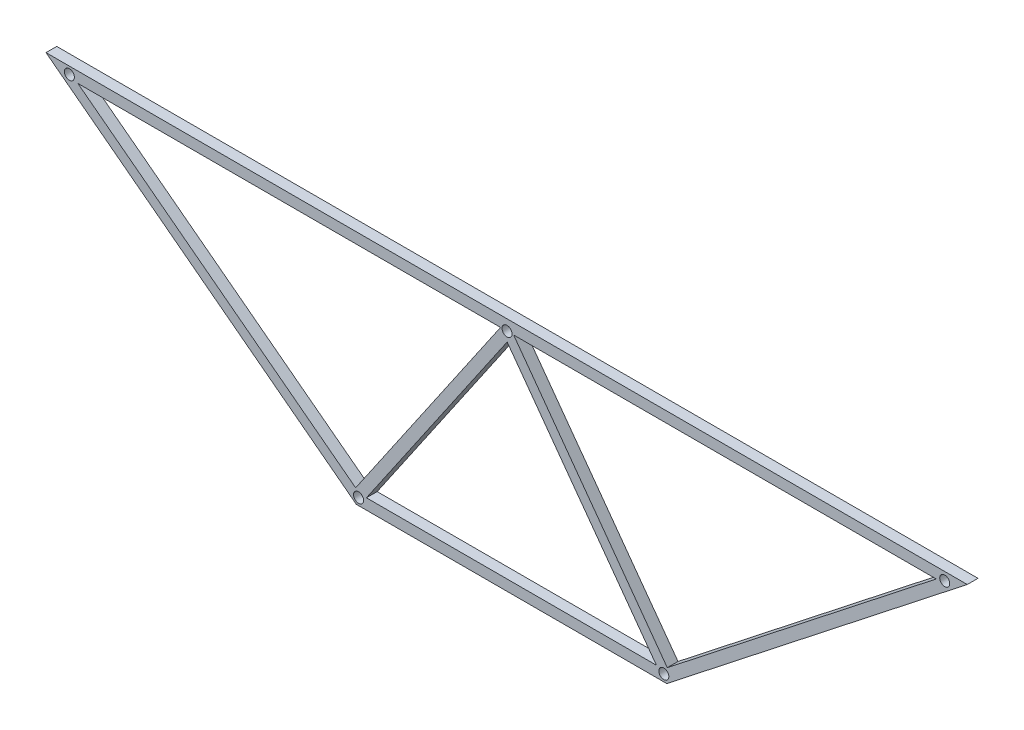
ISO-10303-21;
HEADER;
FILE_DESCRIPTION(('STEP AP214'),'2;1');
FILE_NAME('part.step','',(''),(''),'','','');
FILE_SCHEMA(('AUTOMOTIVE_DESIGN { 1 0 10303 214 1 1 1 1 }'));
ENDSEC;
DATA;
#1=APPLICATION_CONTEXT('core data for automotive mechanical design processes');
#2=APPLICATION_PROTOCOL_DEFINITION('international standard','automotive_design',2000,#1);
#3=PRODUCT_CONTEXT('',#1,'mechanical');
#4=PRODUCT('Part','Part','',(#3));
#5=PRODUCT_RELATED_PRODUCT_CATEGORY('part','',(#4));
#6=PRODUCT_DEFINITION_FORMATION('','',#4);
#7=PRODUCT_DEFINITION_CONTEXT('part definition',#1,'design');
#8=PRODUCT_DEFINITION('design','',#6,#7);
#9=PRODUCT_DEFINITION_SHAPE('','',#8);
#10=(LENGTH_UNIT() NAMED_UNIT(*) SI_UNIT(.MILLI.,.METRE.));
#11=(NAMED_UNIT(*) PLANE_ANGLE_UNIT() SI_UNIT($,.RADIAN.));
#12=(NAMED_UNIT(*) SI_UNIT($,.STERADIAN.) SOLID_ANGLE_UNIT());
#13=UNCERTAINTY_MEASURE_WITH_UNIT(LENGTH_MEASURE(1.E-05),#10,'distance_accuracy_value','');
#14=(GEOMETRIC_REPRESENTATION_CONTEXT(3) GLOBAL_UNCERTAINTY_ASSIGNED_CONTEXT((#13)) GLOBAL_UNIT_ASSIGNED_CONTEXT((#10,
#11,#12)) REPRESENTATION_CONTEXT('',''));
#15=CARTESIAN_POINT('',(0.,0.,0.));
#16=DIRECTION('',(0.,0.,1.));
#17=DIRECTION('',(1.,0.,0.));
#18=AXIS2_PLACEMENT_3D('',#15,#16,#17);
#19=CARTESIAN_POINT('',(0.,0.,15.));
#20=DIRECTION('',(0.,0.,-1.));
#21=DIRECTION('',(-1.,0.,0.));
#22=AXIS2_PLACEMENT_3D('',#19,#20,#21);
#23=PLANE('',#22);
#24=CARTESIAN_POINT('',(-611.831081683874,4.9049906281482,15.));
#25=DIRECTION('',(0.,0.,1.));
#26=DIRECTION('',(1.,0.,0.));
#27=AXIS2_PLACEMENT_3D('',#24,#25,#26);
#28=CIRCLE('',#27,7.00000000000004);
#29=CARTESIAN_POINT('',(-604.831081683874,4.9049906281482,15.));
#30=VERTEX_POINT('',#29);
#31=EDGE_CURVE('E413',#30,#30,#28,.T.);
#32=ORIENTED_EDGE('',*,*,#31,.F.);
#33=EDGE_LOOP('',(#32));
#34=FACE_BOUND('',#33,.T.);
#35=CARTESIAN_POINT('',(219.201774513465,-305.21160756031,15.));
#36=DIRECTION('',(0.,0.,1.));
#37=DIRECTION('',(1.,0.,0.));
#38=AXIS2_PLACEMENT_3D('',#35,#36,#37);
#39=CIRCLE('',#38,7.00000000000002);
#40=CARTESIAN_POINT('',(226.201774513465,-305.21160756031,15.));
#41=VERTEX_POINT('',#40);
#42=EDGE_CURVE('E426',#41,#41,#39,.T.);
#43=ORIENTED_EDGE('',*,*,#42,.F.);
#44=EDGE_LOOP('',(#43));
#45=FACE_BOUND('',#44,.T.);
#46=CARTESIAN_POINT('',(0.,0.,15.));
#47=DIRECTION('',(0.,0.,1.));
#48=DIRECTION('',(1.,0.,0.));
#49=AXIS2_PLACEMENT_3D('',#46,#47,#48);
#50=CIRCLE('',#49,7.);
#51=CARTESIAN_POINT('',(7.,0.,15.));
#52=VERTEX_POINT('',#51);
#53=EDGE_CURVE('E420',#52,#52,#50,.T.);
#54=ORIENTED_EDGE('',*,*,#53,.F.);
#55=EDGE_LOOP('',(#54));
#56=FACE_BOUND('',#55,.T.);
#57=CARTESIAN_POINT('',(-207.544546048894,-305.21160756031,15.));
#58=DIRECTION('',(0.,0.,1.));
#59=DIRECTION('',(1.,0.,0.));
#60=AXIS2_PLACEMENT_3D('',#57,#58,#59);
#61=CIRCLE('',#60,7.00000000000002);
#62=CARTESIAN_POINT('',(-200.544546048894,-305.21160756031,15.));
#63=VERTEX_POINT('',#62);
#64=EDGE_CURVE('E432',#63,#63,#61,.T.);
#65=ORIENTED_EDGE('',*,*,#64,.F.);
#66=EDGE_LOOP('',(#65));
#67=FACE_BOUND('',#66,.T.);
#68=CARTESIAN_POINT('',(611.879096148243,3.70627865372342,15.));
#69=DIRECTION('',(0.,0.,1.));
#70=DIRECTION('',(1.,0.,0.));
#71=AXIS2_PLACEMENT_3D('',#68,#69,#70);
#72=CIRCLE('',#71,7.00000000000004);
#73=CARTESIAN_POINT('',(618.879096148243,3.70627865372342,15.));
#74=VERTEX_POINT('',#73);
#75=EDGE_CURVE('E414',#74,#74,#72,.T.);
#76=ORIENTED_EDGE('',*,*,#75,.F.);
#77=EDGE_LOOP('',(#76));
#78=FACE_BOUND('',#77,.T.);
#79=DIRECTION('',(0.795877335068835,-0.605457899051395,0.));
#80=VECTOR('',#79,1.);
#81=CARTESIAN_POINT('',(-600.,0.,15.));
#82=LINE('',#81,#80);
#83=CARTESIAN_POINT('',(-600.,0.,15.));
#84=VERTEX_POINT('',#83);
#85=CARTESIAN_POINT('',(-211.624925428095,-295.453515677635,15.));
#86=VERTEX_POINT('',#85);
#87=EDGE_CURVE('E162',#84,#86,#82,.T.);
#88=ORIENTED_EDGE('',*,*,#87,.F.);
#89=DIRECTION('',(-1.,0.,0.));
#90=VECTOR('',#89,1.);
#91=CARTESIAN_POINT('',(-9.09296864472943,0.,15.));
#92=LINE('',#91,#90);
#93=CARTESIAN_POINT('',(-9.09296864472943,0.,15.));
#94=VERTEX_POINT('',#93);
#95=EDGE_CURVE('E166',#94,#84,#92,.T.);
#96=ORIENTED_EDGE('',*,*,#95,.F.);
#97=DIRECTION('',(0.565405418856181,0.824813137824602,0.));
#98=VECTOR('',#97,1.);
#99=CARTESIAN_POINT('',(-9.09296864472943,0.,15.));
#100=LINE('',#99,#98);
#101=EDGE_CURVE('E164',#86,#94,#100,.T.);
#102=ORIENTED_EDGE('',*,*,#101,.F.);
#103=EDGE_LOOP('',(#88,#96,#102));
#104=FACE_BOUND('',#103,.T.);
#105=DIRECTION('',(0.795877335068835,-0.605457899051396,0.));
#106=VECTOR('',#105,1.);
#107=CARTESIAN_POINT('',(-644.492210058268,15.,15.));
#108=LINE('',#107,#106);
#109=CARTESIAN_POINT('',(-644.492210058268,15.,15.));
#110=VERTEX_POINT('',#109);
#111=CARTESIAN_POINT('',(-210.705614847921,-315.,15.));
#112=VERTEX_POINT('',#111);
#113=EDGE_CURVE('E211',#110,#112,#108,.T.);
#114=ORIENTED_EDGE('',*,*,#113,.T.);
#115=DIRECTION('',(1.,0.,0.));
#116=VECTOR('',#115,1.);
#117=CARTESIAN_POINT('',(223.310378921664,-315.,15.));
#118=LINE('',#117,#116);
#119=CARTESIAN_POINT('',(223.310378921664,-315.,15.));
#120=VERTEX_POINT('',#119);
#121=EDGE_CURVE('E212',#112,#120,#118,.T.);
#122=ORIENTED_EDGE('',*,*,#121,.T.);
#123=DIRECTION('',(0.78636452058146,0.617762770625335,0.));
#124=VECTOR('',#123,1.);
#125=CARTESIAN_POINT('',(643.37501235563,15.,15.));
#126=LINE('',#125,#124);
#127=CARTESIAN_POINT('',(643.37501235563,15.,15.));
#128=VERTEX_POINT('',#127);
#129=EDGE_CURVE('E220',#120,#128,#126,.T.);
#130=ORIENTED_EDGE('',*,*,#129,.T.);
#131=DIRECTION('',(-1.,0.,0.));
#132=VECTOR('',#131,1.);
#133=CARTESIAN_POINT('',(-644.492210058268,15.,15.));
#134=LINE('',#133,#132);
#135=EDGE_CURVE('E218',#128,#110,#134,.T.);
#136=ORIENTED_EDGE('',*,*,#135,.T.);
#137=EDGE_LOOP('',(#114,#122,#130,#136));
#138=FACE_BOUND('',#137,.T.);
#139=DIRECTION('',(0.78636452058146,0.617762770625335,0.));
#140=VECTOR('',#139,1.);
#141=CARTESIAN_POINT('',(600.,0.,15.));
#142=LINE('',#141,#140);
#143=CARTESIAN_POINT('',(224.024883314789,-295.363567010752,15.));
#144=VERTEX_POINT('',#143);
#145=CARTESIAN_POINT('',(600.,0.,15.));
#146=VERTEX_POINT('',#145);
#147=EDGE_CURVE('E190',#144,#146,#142,.T.);
#148=ORIENTED_EDGE('',*,*,#147,.F.);
#149=DIRECTION('',(0.588068082242328,-0.808811430834054,0.));
#150=VECTOR('',#149,1.);
#151=CARTESIAN_POINT('',(9.27286597849628,0.,15.));
#152=LINE('',#151,#150);
#153=CARTESIAN_POINT('',(9.27286597849628,0.,15.));
#154=VERTEX_POINT('',#153);
#155=EDGE_CURVE('E192',#154,#144,#152,.T.);
#156=ORIENTED_EDGE('',*,*,#155,.F.);
#157=DIRECTION('',(-1.,0.,0.));
#158=VECTOR('',#157,1.);
#159=CARTESIAN_POINT('',(9.27286597849628,0.,15.));
#160=LINE('',#159,#158);
#161=EDGE_CURVE('E186',#146,#154,#160,.T.);
#162=ORIENTED_EDGE('',*,*,#161,.F.);
#163=EDGE_LOOP('',(#148,#156,#162));
#164=FACE_BOUND('',#163,.T.);
#165=DIRECTION('',(-0.588068082242328,0.808811430834054,0.));
#166=VECTOR('',#165,1.);
#167=CARTESIAN_POINT('',(0.180367695807343,-13.0016977370513,15.));
#168=LINE('',#167,#166);
#169=CARTESIAN_POINT('',(208.850194536081,-300.,15.));
#170=VERTEX_POINT('',#169);
#171=CARTESIAN_POINT('',(0.180367695807343,-13.0016977370513,15.));
#172=VERTEX_POINT('',#171);
#173=EDGE_CURVE('E131',#170,#172,#168,.T.);
#174=ORIENTED_EDGE('',*,*,#173,.F.);
#175=DIRECTION('',(1.,0.,0.));
#176=VECTOR('',#175,1.);
#177=CARTESIAN_POINT('',(208.850194536081,-300.,15.));
#178=LINE('',#177,#176);
#179=CARTESIAN_POINT('',(-196.555581164045,-300.,15.));
#180=VERTEX_POINT('',#179);
#181=EDGE_CURVE('E151',#180,#170,#178,.T.);
#182=ORIENTED_EDGE('',*,*,#181,.F.);
#183=DIRECTION('',(-0.565405418856181,-0.824813137824602,0.));
#184=VECTOR('',#183,1.);
#185=CARTESIAN_POINT('',(0.180367695807343,-13.0016977370513,15.));
#186=LINE('',#185,#184);
#187=EDGE_CURVE('E142',#172,#180,#186,.T.);
#188=ORIENTED_EDGE('',*,*,#187,.F.);
#189=EDGE_LOOP('',(#174,#182,#188));
#190=FACE_BOUND('',#189,.T.);
#191=ADVANCED_FACE('F39',(#34,#45,#56,#67,#78,#104,#138,#164,#190),#23,.F.);
#192=CARTESIAN_POINT('',(0.,0.,0.));
#193=DIRECTION('',(0.,0.,-1.));
#194=DIRECTION('',(-1.,0.,0.));
#195=AXIS2_PLACEMENT_3D('',#192,#193,#194);
#196=PLANE('',#195);
#197=CARTESIAN_POINT('',(-611.831081683874,4.9049906281482,0.));
#198=DIRECTION('',(0.,0.,1.));
#199=DIRECTION('',(1.,0.,0.));
#200=AXIS2_PLACEMENT_3D('',#197,#198,#199);
#201=CIRCLE('',#200,7.00000000000004);
#202=CARTESIAN_POINT('',(-604.831081683874,4.9049906281482,0.));
#203=VERTEX_POINT('',#202);
#204=EDGE_CURVE('E160',#203,#203,#201,.T.);
#205=ORIENTED_EDGE('',*,*,#204,.T.);
#206=EDGE_LOOP('',(#205));
#207=FACE_BOUND('',#206,.T.);
#208=CARTESIAN_POINT('',(219.201774513465,-305.21160756031,0.));
#209=DIRECTION('',(0.,0.,1.));
#210=DIRECTION('',(1.,0.,0.));
#211=AXIS2_PLACEMENT_3D('',#208,#209,#210);
#212=CIRCLE('',#211,7.00000000000002);
#213=CARTESIAN_POINT('',(226.201774513465,-305.21160756031,0.));
#214=VERTEX_POINT('',#213);
#215=EDGE_CURVE('E427',#214,#214,#212,.T.);
#216=ORIENTED_EDGE('',*,*,#215,.T.);
#217=EDGE_LOOP('',(#216));
#218=FACE_BOUND('',#217,.T.);
#219=CARTESIAN_POINT('',(0.,0.,0.));
#220=DIRECTION('',(0.,0.,1.));
#221=DIRECTION('',(1.,0.,0.));
#222=AXIS2_PLACEMENT_3D('',#219,#220,#221);
#223=CIRCLE('',#222,7.);
#224=CARTESIAN_POINT('',(7.,0.,0.));
#225=VERTEX_POINT('',#224);
#226=EDGE_CURVE('E421',#225,#225,#223,.T.);
#227=ORIENTED_EDGE('',*,*,#226,.T.);
#228=EDGE_LOOP('',(#227));
#229=FACE_BOUND('',#228,.T.);
#230=CARTESIAN_POINT('',(-207.544546048894,-305.21160756031,0.));
#231=DIRECTION('',(0.,0.,1.));
#232=DIRECTION('',(1.,0.,0.));
#233=AXIS2_PLACEMENT_3D('',#230,#231,#232);
#234=CIRCLE('',#233,7.00000000000002);
#235=CARTESIAN_POINT('',(-200.544546048894,-305.21160756031,0.));
#236=VERTEX_POINT('',#235);
#237=EDGE_CURVE('E425',#236,#236,#234,.T.);
#238=ORIENTED_EDGE('',*,*,#237,.T.);
#239=EDGE_LOOP('',(#238));
#240=FACE_BOUND('',#239,.T.);
#241=CARTESIAN_POINT('',(611.879096148243,3.70627865372342,0.));
#242=DIRECTION('',(0.,0.,1.));
#243=DIRECTION('',(1.,0.,0.));
#244=AXIS2_PLACEMENT_3D('',#241,#242,#243);
#245=CIRCLE('',#244,7.00000000000004);
#246=CARTESIAN_POINT('',(618.879096148243,3.70627865372342,0.));
#247=VERTEX_POINT('',#246);
#248=EDGE_CURVE('E418',#247,#247,#245,.T.);
#249=ORIENTED_EDGE('',*,*,#248,.T.);
#250=EDGE_LOOP('',(#249));
#251=FACE_BOUND('',#250,.T.);
#252=DIRECTION('',(0.795877335068835,-0.605457899051396,0.));
#253=VECTOR('',#252,1.);
#254=CARTESIAN_POINT('',(-644.492210058268,15.,0.));
#255=LINE('',#254,#253);
#256=CARTESIAN_POINT('',(-644.492210058268,15.,0.));
#257=VERTEX_POINT('',#256);
#258=CARTESIAN_POINT('',(-210.705614847921,-315.,0.));
#259=VERTEX_POINT('',#258);
#260=EDGE_CURVE('E209',#257,#259,#255,.T.);
#261=ORIENTED_EDGE('',*,*,#260,.F.);
#262=DIRECTION('',(-1.,0.,0.));
#263=VECTOR('',#262,1.);
#264=CARTESIAN_POINT('',(-644.492210058268,15.,0.));
#265=LINE('',#264,#263);
#266=CARTESIAN_POINT('',(643.37501235563,15.,0.));
#267=VERTEX_POINT('',#266);
#268=EDGE_CURVE('E214',#267,#257,#265,.T.);
#269=ORIENTED_EDGE('',*,*,#268,.F.);
#270=DIRECTION('',(0.78636452058146,0.617762770625335,0.));
#271=VECTOR('',#270,1.);
#272=CARTESIAN_POINT('',(643.37501235563,15.,0.));
#273=LINE('',#272,#271);
#274=CARTESIAN_POINT('',(223.310378921664,-315.,0.));
#275=VERTEX_POINT('',#274);
#276=EDGE_CURVE('E227',#275,#267,#273,.T.);
#277=ORIENTED_EDGE('',*,*,#276,.F.);
#278=DIRECTION('',(1.,0.,0.));
#279=VECTOR('',#278,1.);
#280=CARTESIAN_POINT('',(223.310378921664,-315.,0.));
#281=LINE('',#280,#279);
#282=EDGE_CURVE('E221',#259,#275,#281,.T.);
#283=ORIENTED_EDGE('',*,*,#282,.F.);
#284=EDGE_LOOP('',(#261,#269,#277,#283));
#285=FACE_BOUND('',#284,.T.);
#286=DIRECTION('',(0.588068082242328,-0.808811430834054,0.));
#287=VECTOR('',#286,1.);
#288=CARTESIAN_POINT('',(9.27286597849628,0.,0.));
#289=LINE('',#288,#287);
#290=CARTESIAN_POINT('',(9.27286597849628,0.,0.));
#291=VERTEX_POINT('',#290);
#292=CARTESIAN_POINT('',(224.024883314789,-295.363567010752,0.));
#293=VERTEX_POINT('',#292);
#294=EDGE_CURVE('E188',#291,#293,#289,.T.);
#295=ORIENTED_EDGE('',*,*,#294,.T.);
#296=DIRECTION('',(0.78636452058146,0.617762770625335,0.));
#297=VECTOR('',#296,1.);
#298=CARTESIAN_POINT('',(600.,0.,0.));
#299=LINE('',#298,#297);
#300=CARTESIAN_POINT('',(600.,0.,0.));
#301=VERTEX_POINT('',#300);
#302=EDGE_CURVE('E187',#293,#301,#299,.T.);
#303=ORIENTED_EDGE('',*,*,#302,.T.);
#304=DIRECTION('',(-1.,0.,0.));
#305=VECTOR('',#304,1.);
#306=CARTESIAN_POINT('',(9.27286597849628,0.,0.));
#307=LINE('',#306,#305);
#308=EDGE_CURVE('E196',#301,#291,#307,.T.);
#309=ORIENTED_EDGE('',*,*,#308,.T.);
#310=EDGE_LOOP('',(#295,#303,#309));
#311=FACE_BOUND('',#310,.T.);
#312=DIRECTION('',(-1.,0.,0.));
#313=VECTOR('',#312,1.);
#314=CARTESIAN_POINT('',(-9.09296864472943,0.,0.));
#315=LINE('',#314,#313);
#316=CARTESIAN_POINT('',(-9.09296864472943,0.,0.));
#317=VERTEX_POINT('',#316);
#318=CARTESIAN_POINT('',(-600.,0.,0.));
#319=VERTEX_POINT('',#318);
#320=EDGE_CURVE('E167',#317,#319,#315,.T.);
#321=ORIENTED_EDGE('',*,*,#320,.T.);
#322=DIRECTION('',(0.795877335068835,-0.605457899051395,0.));
#323=VECTOR('',#322,1.);
#324=CARTESIAN_POINT('',(-600.,0.,0.));
#325=LINE('',#324,#323);
#326=CARTESIAN_POINT('',(-211.624925428095,-295.453515677635,0.));
#327=VERTEX_POINT('',#326);
#328=EDGE_CURVE('E149',#319,#327,#325,.T.);
#329=ORIENTED_EDGE('',*,*,#328,.T.);
#330=DIRECTION('',(0.565405418856181,0.824813137824602,0.));
#331=VECTOR('',#330,1.);
#332=CARTESIAN_POINT('',(-9.09296864472943,0.,0.));
#333=LINE('',#332,#331);
#334=EDGE_CURVE('E171',#327,#317,#333,.T.);
#335=ORIENTED_EDGE('',*,*,#334,.T.);
#336=EDGE_LOOP('',(#321,#329,#335));
#337=FACE_BOUND('',#336,.T.);
#338=DIRECTION('',(1.,0.,0.));
#339=VECTOR('',#338,1.);
#340=CARTESIAN_POINT('',(208.850194536081,-300.,0.));
#341=LINE('',#340,#339);
#342=CARTESIAN_POINT('',(-196.555581164045,-300.,0.));
#343=VERTEX_POINT('',#342);
#344=CARTESIAN_POINT('',(208.850194536081,-300.,0.));
#345=VERTEX_POINT('',#344);
#346=EDGE_CURVE('E141',#343,#345,#341,.T.);
#347=ORIENTED_EDGE('',*,*,#346,.T.);
#348=DIRECTION('',(-0.588068082242328,0.808811430834054,0.));
#349=VECTOR('',#348,1.);
#350=CARTESIAN_POINT('',(0.180367695807343,-13.0016977370513,0.));
#351=LINE('',#350,#349);
#352=CARTESIAN_POINT('',(0.180367695807343,-13.0016977370513,0.));
#353=VERTEX_POINT('',#352);
#354=EDGE_CURVE('E65',#345,#353,#351,.T.);
#355=ORIENTED_EDGE('',*,*,#354,.T.);
#356=DIRECTION('',(-0.565405418856181,-0.824813137824602,0.));
#357=VECTOR('',#356,1.);
#358=CARTESIAN_POINT('',(0.180367695807343,-13.0016977370513,0.));
#359=LINE('',#358,#357);
#360=EDGE_CURVE('E146',#353,#343,#359,.T.);
#361=ORIENTED_EDGE('',*,*,#360,.T.);
#362=EDGE_LOOP('',(#347,#355,#361));
#363=FACE_BOUND('',#362,.T.);
#364=ADVANCED_FACE('F241',(#207,#218,#229,#240,#251,#285,#311,#337,#363),#196,.T.);
#365=CARTESIAN_POINT('',(-644.492210058268,15.,15.));
#366=DIRECTION('',(0.605457899051395,0.795877335068835,0.));
#367=DIRECTION('',(-0.795877335068835,0.605457899051395,0.));
#368=AXIS2_PLACEMENT_3D('',#365,#366,#367);
#369=PLANE('',#368);
#370=ORIENTED_EDGE('',*,*,#260,.T.);
#371=DIRECTION('',(0.,0.,-1.));
#372=VECTOR('',#371,1.);
#373=CARTESIAN_POINT('',(-210.705614847921,-315.,15.));
#374=LINE('',#373,#372);
#375=EDGE_CURVE('E11',#112,#259,#374,.T.);
#376=ORIENTED_EDGE('',*,*,#375,.F.);
#377=ORIENTED_EDGE('',*,*,#113,.F.);
#378=DIRECTION('',(0.,0.,-1.));
#379=VECTOR('',#378,1.);
#380=CARTESIAN_POINT('',(-644.492210058268,15.,15.));
#381=LINE('',#380,#379);
#382=EDGE_CURVE('E222',#110,#257,#381,.T.);
#383=ORIENTED_EDGE('',*,*,#382,.T.);
#384=EDGE_LOOP('',(#370,#376,#377,#383));
#385=FACE_BOUND('',#384,.T.);
#386=ADVANCED_FACE('F41',(#385),#369,.F.);
#387=CARTESIAN_POINT('',(223.310378921664,-315.,15.));
#388=DIRECTION('',(0.,1.,0.));
#389=DIRECTION('',(-1.,0.,0.));
#390=AXIS2_PLACEMENT_3D('',#387,#388,#389);
#391=PLANE('',#390);
#392=ORIENTED_EDGE('',*,*,#282,.T.);
#393=DIRECTION('',(0.,0.,-1.));
#394=VECTOR('',#393,1.);
#395=CARTESIAN_POINT('',(223.310378921664,-315.,15.));
#396=LINE('',#395,#394);
#397=EDGE_CURVE('E50',#120,#275,#396,.T.);
#398=ORIENTED_EDGE('',*,*,#397,.F.);
#399=ORIENTED_EDGE('',*,*,#121,.F.);
#400=ORIENTED_EDGE('',*,*,#375,.T.);
#401=EDGE_LOOP('',(#392,#398,#399,#400));
#402=FACE_BOUND('',#401,.T.);
#403=ADVANCED_FACE('F254',(#402),#391,.F.);
#404=CARTESIAN_POINT('',(643.37501235563,15.,15.));
#405=DIRECTION('',(-0.617762770625335,0.78636452058146,0.));
#406=DIRECTION('',(-0.78636452058146,-0.617762770625335,0.));
#407=AXIS2_PLACEMENT_3D('',#404,#405,#406);
#408=PLANE('',#407);
#409=ORIENTED_EDGE('',*,*,#276,.T.);
#410=DIRECTION('',(0.,0.,-1.));
#411=VECTOR('',#410,1.);
#412=CARTESIAN_POINT('',(643.37501235563,15.,15.));
#413=LINE('',#412,#411);
#414=EDGE_CURVE('E233',#128,#267,#413,.T.);
#415=ORIENTED_EDGE('',*,*,#414,.F.);
#416=ORIENTED_EDGE('',*,*,#129,.F.);
#417=ORIENTED_EDGE('',*,*,#397,.T.);
#418=EDGE_LOOP('',(#409,#415,#416,#417));
#419=FACE_BOUND('',#418,.T.);
#420=ADVANCED_FACE('F236',(#419),#408,.F.);
#421=CARTESIAN_POINT('',(-644.492210058268,15.,15.));
#422=DIRECTION('',(0.,-1.,0.));
#423=DIRECTION('',(1.,0.,0.));
#424=AXIS2_PLACEMENT_3D('',#421,#422,#423);
#425=PLANE('',#424);
#426=ORIENTED_EDGE('',*,*,#268,.T.);
#427=ORIENTED_EDGE('',*,*,#382,.F.);
#428=ORIENTED_EDGE('',*,*,#135,.F.);
#429=ORIENTED_EDGE('',*,*,#414,.T.);
#430=EDGE_LOOP('',(#426,#427,#428,#429));
#431=FACE_BOUND('',#430,.T.);
#432=ADVANCED_FACE('F247',(#431),#425,.F.);
#433=CARTESIAN_POINT('',(600.,0.,15.));
#434=DIRECTION('',(-0.617762770625335,0.78636452058146,0.));
#435=DIRECTION('',(-0.78636452058146,-0.617762770625335,0.));
#436=AXIS2_PLACEMENT_3D('',#433,#434,#435);
#437=PLANE('',#436);
#438=ORIENTED_EDGE('',*,*,#302,.F.);
#439=DIRECTION('',(0.,0.,-1.));
#440=VECTOR('',#439,1.);
#441=CARTESIAN_POINT('',(224.024883314789,-295.363567010752,15.));
#442=LINE('',#441,#440);
#443=EDGE_CURVE('E191',#144,#293,#442,.T.);
#444=ORIENTED_EDGE('',*,*,#443,.F.);
#445=ORIENTED_EDGE('',*,*,#147,.T.);
#446=DIRECTION('',(0.,0.,-1.));
#447=VECTOR('',#446,1.);
#448=CARTESIAN_POINT('',(600.,0.,15.));
#449=LINE('',#448,#447);
#450=EDGE_CURVE('E210',#146,#301,#449,.T.);
#451=ORIENTED_EDGE('',*,*,#450,.T.);
#452=EDGE_LOOP('',(#438,#444,#445,#451));
#453=FACE_BOUND('',#452,.T.);
#454=ADVANCED_FACE('F273',(#453),#437,.T.);
#455=CARTESIAN_POINT('',(9.27286597849628,0.,15.));
#456=DIRECTION('',(0.,-1.,0.));
#457=DIRECTION('',(1.,0.,0.));
#458=AXIS2_PLACEMENT_3D('',#455,#456,#457);
#459=PLANE('',#458);
#460=ORIENTED_EDGE('',*,*,#308,.F.);
#461=ORIENTED_EDGE('',*,*,#450,.F.);
#462=ORIENTED_EDGE('',*,*,#161,.T.);
#463=DIRECTION('',(0.,0.,-1.));
#464=VECTOR('',#463,1.);
#465=CARTESIAN_POINT('',(9.27286597849628,0.,15.));
#466=LINE('',#465,#464);
#467=EDGE_CURVE('E202',#154,#291,#466,.T.);
#468=ORIENTED_EDGE('',*,*,#467,.T.);
#469=EDGE_LOOP('',(#460,#461,#462,#468));
#470=FACE_BOUND('',#469,.T.);
#471=ADVANCED_FACE('F282',(#470),#459,.T.);
#472=CARTESIAN_POINT('',(9.27286597849628,0.,15.));
#473=DIRECTION('',(0.808811430834054,0.588068082242328,0.));
#474=DIRECTION('',(-0.588068082242328,0.808811430834054,0.));
#475=AXIS2_PLACEMENT_3D('',#472,#473,#474);
#476=PLANE('',#475);
#477=ORIENTED_EDGE('',*,*,#294,.F.);
#478=ORIENTED_EDGE('',*,*,#467,.F.);
#479=ORIENTED_EDGE('',*,*,#155,.T.);
#480=ORIENTED_EDGE('',*,*,#443,.T.);
#481=EDGE_LOOP('',(#477,#478,#479,#480));
#482=FACE_BOUND('',#481,.T.);
#483=ADVANCED_FACE('F288',(#482),#476,.T.);
#484=CARTESIAN_POINT('',(-600.,0.,15.));
#485=DIRECTION('',(0.605457899051395,0.795877335068835,0.));
#486=DIRECTION('',(-0.795877335068835,0.605457899051395,0.));
#487=AXIS2_PLACEMENT_3D('',#484,#485,#486);
#488=PLANE('',#487);
#489=ORIENTED_EDGE('',*,*,#328,.F.);
#490=DIRECTION('',(0.,0.,-1.));
#491=VECTOR('',#490,1.);
#492=CARTESIAN_POINT('',(-600.,0.,15.));
#493=LINE('',#492,#491);
#494=EDGE_CURVE('E172',#84,#319,#493,.T.);
#495=ORIENTED_EDGE('',*,*,#494,.F.);
#496=ORIENTED_EDGE('',*,*,#87,.T.);
#497=DIRECTION('',(0.,0.,-1.));
#498=VECTOR('',#497,1.);
#499=CARTESIAN_POINT('',(-211.624925428095,-295.453515677635,15.));
#500=LINE('',#499,#498);
#501=EDGE_CURVE('E181',#86,#327,#500,.T.);
#502=ORIENTED_EDGE('',*,*,#501,.T.);
#503=EDGE_LOOP('',(#489,#495,#496,#502));
#504=FACE_BOUND('',#503,.T.);
#505=ADVANCED_FACE('F319',(#504),#488,.T.);
#506=CARTESIAN_POINT('',(-9.09296864472943,0.,15.));
#507=DIRECTION('',(-0.824813137824602,0.565405418856181,0.));
#508=DIRECTION('',(-0.565405418856181,-0.824813137824602,0.));
#509=AXIS2_PLACEMENT_3D('',#506,#507,#508);
#510=PLANE('',#509);
#511=ORIENTED_EDGE('',*,*,#334,.F.);
#512=ORIENTED_EDGE('',*,*,#501,.F.);
#513=ORIENTED_EDGE('',*,*,#101,.T.);
#514=DIRECTION('',(0.,0.,-1.));
#515=VECTOR('',#514,1.);
#516=CARTESIAN_POINT('',(-9.09296864472943,0.,15.));
#517=LINE('',#516,#515);
#518=EDGE_CURVE('E182',#94,#317,#517,.T.);
#519=ORIENTED_EDGE('',*,*,#518,.T.);
#520=EDGE_LOOP('',(#511,#512,#513,#519));
#521=FACE_BOUND('',#520,.T.);
#522=ADVANCED_FACE('F316',(#521),#510,.T.);
#523=CARTESIAN_POINT('',(-9.09296864472943,0.,15.));
#524=DIRECTION('',(0.,-1.,0.));
#525=DIRECTION('',(1.,0.,0.));
#526=AXIS2_PLACEMENT_3D('',#523,#524,#525);
#527=PLANE('',#526);
#528=ORIENTED_EDGE('',*,*,#320,.F.);
#529=ORIENTED_EDGE('',*,*,#518,.F.);
#530=ORIENTED_EDGE('',*,*,#95,.T.);
#531=ORIENTED_EDGE('',*,*,#494,.T.);
#532=EDGE_LOOP('',(#528,#529,#530,#531));
#533=FACE_BOUND('',#532,.T.);
#534=ADVANCED_FACE('F311',(#533),#527,.T.);
#535=CARTESIAN_POINT('',(0.180367695807343,-13.0016977370513,15.));
#536=DIRECTION('',(-0.808811430834054,-0.588068082242328,0.));
#537=DIRECTION('',(0.588068082242328,-0.808811430834054,0.));
#538=AXIS2_PLACEMENT_3D('',#535,#536,#537);
#539=PLANE('',#538);
#540=ORIENTED_EDGE('',*,*,#354,.F.);
#541=DIRECTION('',(0.,0.,-1.));
#542=VECTOR('',#541,1.);
#543=CARTESIAN_POINT('',(208.850194536081,-300.,15.));
#544=LINE('',#543,#542);
#545=EDGE_CURVE('E137',#170,#345,#544,.T.);
#546=ORIENTED_EDGE('',*,*,#545,.F.);
#547=ORIENTED_EDGE('',*,*,#173,.T.);
#548=DIRECTION('',(0.,0.,-1.));
#549=VECTOR('',#548,1.);
#550=CARTESIAN_POINT('',(0.180367695807343,-13.0016977370513,15.));
#551=LINE('',#550,#549);
#552=EDGE_CURVE('E139',#172,#353,#551,.T.);
#553=ORIENTED_EDGE('',*,*,#552,.T.);
#554=EDGE_LOOP('',(#540,#546,#547,#553));
#555=FACE_BOUND('',#554,.T.);
#556=ADVANCED_FACE('F138',(#555),#539,.T.);
#557=CARTESIAN_POINT('',(0.180367695807343,-13.0016977370513,15.));
#558=DIRECTION('',(0.824813137824602,-0.565405418856181,0.));
#559=DIRECTION('',(0.565405418856181,0.824813137824603,0.));
#560=AXIS2_PLACEMENT_3D('',#557,#558,#559);
#561=PLANE('',#560);
#562=ORIENTED_EDGE('',*,*,#360,.F.);
#563=ORIENTED_EDGE('',*,*,#552,.F.);
#564=ORIENTED_EDGE('',*,*,#187,.T.);
#565=DIRECTION('',(0.,0.,-1.));
#566=VECTOR('',#565,1.);
#567=CARTESIAN_POINT('',(-196.555581164045,-300.,15.));
#568=LINE('',#567,#566);
#569=EDGE_CURVE('E53',#180,#343,#568,.T.);
#570=ORIENTED_EDGE('',*,*,#569,.T.);
#571=EDGE_LOOP('',(#562,#563,#564,#570));
#572=FACE_BOUND('',#571,.T.);
#573=ADVANCED_FACE('F148',(#572),#561,.T.);
#574=CARTESIAN_POINT('',(208.850194536081,-300.,15.));
#575=DIRECTION('',(0.,1.,0.));
#576=DIRECTION('',(-1.,0.,0.));
#577=AXIS2_PLACEMENT_3D('',#574,#575,#576);
#578=PLANE('',#577);
#579=ORIENTED_EDGE('',*,*,#346,.F.);
#580=ORIENTED_EDGE('',*,*,#569,.F.);
#581=ORIENTED_EDGE('',*,*,#181,.T.);
#582=ORIENTED_EDGE('',*,*,#545,.T.);
#583=EDGE_LOOP('',(#579,#580,#581,#582));
#584=FACE_BOUND('',#583,.T.);
#585=ADVANCED_FACE('F299',(#584),#578,.T.);
#586=CARTESIAN_POINT('',(611.879096148243,3.70627865372342,0.));
#587=DIRECTION('',(0.,0.,1.));
#588=DIRECTION('',(1.,0.,0.));
#589=AXIS2_PLACEMENT_3D('',#586,#587,#588);
#590=CYLINDRICAL_SURFACE('',#589,7.00000000000004);
#591=ORIENTED_EDGE('',*,*,#248,.F.);
#592=EDGE_LOOP('',(#591));
#593=FACE_BOUND('',#592,.T.);
#594=ORIENTED_EDGE('',*,*,#75,.T.);
#595=EDGE_LOOP('',(#594));
#596=FACE_BOUND('',#595,.T.);
#597=ADVANCED_FACE('F296',(#593,#596),#590,.F.);
#598=CARTESIAN_POINT('',(-207.544546048894,-305.21160756031,0.));
#599=DIRECTION('',(0.,0.,1.));
#600=DIRECTION('',(1.,0.,0.));
#601=AXIS2_PLACEMENT_3D('',#598,#599,#600);
#602=CYLINDRICAL_SURFACE('',#601,7.00000000000002);
#603=ORIENTED_EDGE('',*,*,#237,.F.);
#604=EDGE_LOOP('',(#603));
#605=FACE_BOUND('',#604,.T.);
#606=ORIENTED_EDGE('',*,*,#64,.T.);
#607=EDGE_LOOP('',(#606));
#608=FACE_BOUND('',#607,.T.);
#609=ADVANCED_FACE('F301',(#605,#608),#602,.F.);
#610=CARTESIAN_POINT('',(0.,0.,0.));
#611=DIRECTION('',(0.,0.,1.));
#612=DIRECTION('',(1.,0.,0.));
#613=AXIS2_PLACEMENT_3D('',#610,#611,#612);
#614=CYLINDRICAL_SURFACE('',#613,7.);
#615=ORIENTED_EDGE('',*,*,#226,.F.);
#616=EDGE_LOOP('',(#615));
#617=FACE_BOUND('',#616,.T.);
#618=ORIENTED_EDGE('',*,*,#53,.T.);
#619=EDGE_LOOP('',(#618));
#620=FACE_BOUND('',#619,.T.);
#621=ADVANCED_FACE('F374',(#617,#620),#614,.F.);
#622=CARTESIAN_POINT('',(219.201774513465,-305.21160756031,0.));
#623=DIRECTION('',(0.,0.,1.));
#624=DIRECTION('',(1.,0.,0.));
#625=AXIS2_PLACEMENT_3D('',#622,#623,#624);
#626=CYLINDRICAL_SURFACE('',#625,7.00000000000002);
#627=ORIENTED_EDGE('',*,*,#215,.F.);
#628=EDGE_LOOP('',(#627));
#629=FACE_BOUND('',#628,.T.);
#630=ORIENTED_EDGE('',*,*,#42,.T.);
#631=EDGE_LOOP('',(#630));
#632=FACE_BOUND('',#631,.T.);
#633=ADVANCED_FACE('F383',(#629,#632),#626,.F.);
#634=CARTESIAN_POINT('',(-611.831081683874,4.9049906281482,0.));
#635=DIRECTION('',(0.,0.,1.));
#636=DIRECTION('',(1.,0.,0.));
#637=AXIS2_PLACEMENT_3D('',#634,#635,#636);
#638=CYLINDRICAL_SURFACE('',#637,7.00000000000004);
#639=ORIENTED_EDGE('',*,*,#204,.F.);
#640=EDGE_LOOP('',(#639));
#641=FACE_BOUND('',#640,.T.);
#642=ORIENTED_EDGE('',*,*,#31,.T.);
#643=EDGE_LOOP('',(#642));
#644=FACE_BOUND('',#643,.T.);
#645=ADVANCED_FACE('F391',(#641,#644),#638,.F.);
#646=CLOSED_SHELL('',(#191,#364,#386,#403,#420,#432,#454,#471,#483,#505,#522,#534,#556,#573,
#585,#597,#609,#621,#633,#645));
#647=MANIFOLD_SOLID_BREP('B2',#646);
#648=ADVANCED_BREP_SHAPE_REPRESENTATION('',(#18,#647),#14);
#649=SHAPE_DEFINITION_REPRESENTATION(#9,#648);
ENDSEC;
END-ISO-10303-21;
